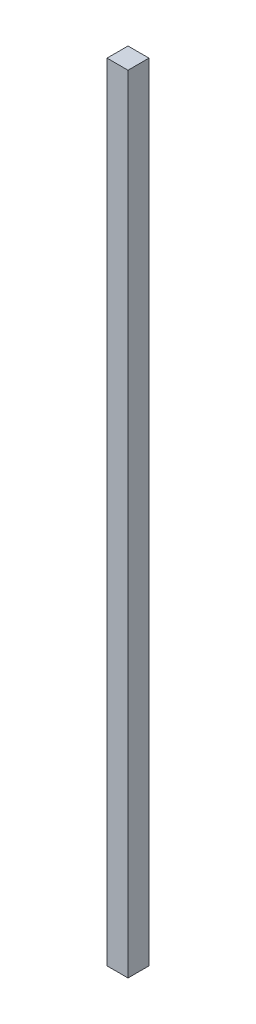
ISO-10303-21;
HEADER;
FILE_DESCRIPTION(('STEP AP214'),'2;1');
FILE_NAME('part.step','',(''),(''),'','','');
FILE_SCHEMA(('AUTOMOTIVE_DESIGN { 1 0 10303 214 1 1 1 1 }'));
ENDSEC;
DATA;
#1=APPLICATION_CONTEXT('core data for automotive mechanical design processes');
#2=APPLICATION_PROTOCOL_DEFINITION('international standard','automotive_design',2000,#1);
#3=PRODUCT_CONTEXT('',#1,'mechanical');
#4=PRODUCT('Part','Part','',(#3));
#5=PRODUCT_RELATED_PRODUCT_CATEGORY('part','',(#4));
#6=PRODUCT_DEFINITION_FORMATION('','',#4);
#7=PRODUCT_DEFINITION_CONTEXT('part definition',#1,'design');
#8=PRODUCT_DEFINITION('design','',#6,#7);
#9=PRODUCT_DEFINITION_SHAPE('','',#8);
#10=(LENGTH_UNIT() NAMED_UNIT(*) SI_UNIT(.MILLI.,.METRE.));
#11=(NAMED_UNIT(*) PLANE_ANGLE_UNIT() SI_UNIT($,.RADIAN.));
#12=(NAMED_UNIT(*) SI_UNIT($,.STERADIAN.) SOLID_ANGLE_UNIT());
#13=UNCERTAINTY_MEASURE_WITH_UNIT(LENGTH_MEASURE(1.E-05),#10,'distance_accuracy_value','');
#14=(GEOMETRIC_REPRESENTATION_CONTEXT(3) GLOBAL_UNCERTAINTY_ASSIGNED_CONTEXT((#13)) GLOBAL_UNIT_ASSIGNED_CONTEXT((#10,
#11,#12)) REPRESENTATION_CONTEXT('',''));
#15=CARTESIAN_POINT('',(0.,0.,0.));
#16=DIRECTION('',(0.,0.,1.));
#17=DIRECTION('',(1.,0.,0.));
#18=AXIS2_PLACEMENT_3D('',#15,#16,#17);
#19=CARTESIAN_POINT('',(2.,150.,-2.));
#20=DIRECTION('',(-1.,0.,0.));
#21=DIRECTION('',(0.,0.,1.));
#22=AXIS2_PLACEMENT_3D('',#19,#20,#21);
#23=PLANE('',#22);
#24=DIRECTION('',(0.,0.,-1.));
#25=VECTOR('',#24,1.);
#26=CARTESIAN_POINT('',(2.,0.,-2.));
#27=LINE('',#26,#25);
#28=CARTESIAN_POINT('',(2.,0.,2.));
#29=VERTEX_POINT('',#28);
#30=CARTESIAN_POINT('',(2.,0.,-2.));
#31=VERTEX_POINT('',#30);
#32=EDGE_CURVE('E113',#29,#31,#27,.T.);
#33=ORIENTED_EDGE('',*,*,#32,.T.);
#34=DIRECTION('',(0.,-1.,0.));
#35=VECTOR('',#34,1.);
#36=CARTESIAN_POINT('',(2.,150.,-2.));
#37=LINE('',#36,#35);
#38=CARTESIAN_POINT('',(2.,150.,-2.));
#39=VERTEX_POINT('',#38);
#40=EDGE_CURVE('E11',#39,#31,#37,.T.);
#41=ORIENTED_EDGE('',*,*,#40,.F.);
#42=DIRECTION('',(0.,0.,-1.));
#43=VECTOR('',#42,1.);
#44=CARTESIAN_POINT('',(2.,150.,-2.));
#45=LINE('',#44,#43);
#46=CARTESIAN_POINT('',(2.,150.,2.));
#47=VERTEX_POINT('',#46);
#48=EDGE_CURVE('E97',#47,#39,#45,.T.);
#49=ORIENTED_EDGE('',*,*,#48,.F.);
#50=DIRECTION('',(0.,-1.,0.));
#51=VECTOR('',#50,1.);
#52=CARTESIAN_POINT('',(2.,150.,2.));
#53=LINE('',#52,#51);
#54=EDGE_CURVE('E109',#47,#29,#53,.T.);
#55=ORIENTED_EDGE('',*,*,#54,.T.);
#56=EDGE_LOOP('',(#33,#41,#49,#55));
#57=FACE_BOUND('',#56,.T.);
#58=ADVANCED_FACE('F45',(#57),#23,.F.);
#59=CARTESIAN_POINT('',(-2.,150.,-2.));
#60=DIRECTION('',(0.,0.,1.));
#61=DIRECTION('',(1.,0.,0.));
#62=AXIS2_PLACEMENT_3D('',#59,#60,#61);
#63=PLANE('',#62);
#64=DIRECTION('',(-1.,0.,0.));
#65=VECTOR('',#64,1.);
#66=CARTESIAN_POINT('',(-2.,0.,-2.));
#67=LINE('',#66,#65);
#68=CARTESIAN_POINT('',(-2.,0.,-2.));
#69=VERTEX_POINT('',#68);
#70=EDGE_CURVE('E102',#31,#69,#67,.T.);
#71=ORIENTED_EDGE('',*,*,#70,.T.);
#72=DIRECTION('',(0.,-1.,0.));
#73=VECTOR('',#72,1.);
#74=CARTESIAN_POINT('',(-2.,150.,-2.));
#75=LINE('',#74,#73);
#76=CARTESIAN_POINT('',(-2.,150.,-2.));
#77=VERTEX_POINT('',#76);
#78=EDGE_CURVE('E54',#77,#69,#75,.T.);
#79=ORIENTED_EDGE('',*,*,#78,.F.);
#80=DIRECTION('',(-1.,0.,0.));
#81=VECTOR('',#80,1.);
#82=CARTESIAN_POINT('',(-2.,150.,-2.));
#83=LINE('',#82,#81);
#84=EDGE_CURVE('E92',#39,#77,#83,.T.);
#85=ORIENTED_EDGE('',*,*,#84,.F.);
#86=ORIENTED_EDGE('',*,*,#40,.T.);
#87=EDGE_LOOP('',(#71,#79,#85,#86));
#88=FACE_BOUND('',#87,.T.);
#89=ADVANCED_FACE('F101',(#88),#63,.F.);
#90=CARTESIAN_POINT('',(-2.,150.,-2.));
#91=DIRECTION('',(1.,0.,0.));
#92=DIRECTION('',(0.,0.,-1.));
#93=AXIS2_PLACEMENT_3D('',#90,#91,#92);
#94=PLANE('',#93);
#95=DIRECTION('',(0.,0.,1.));
#96=VECTOR('',#95,1.);
#97=CARTESIAN_POINT('',(-2.,0.,-2.));
#98=LINE('',#97,#96);
#99=CARTESIAN_POINT('',(-2.,0.,2.));
#100=VERTEX_POINT('',#99);
#101=EDGE_CURVE('E79',#69,#100,#98,.T.);
#102=ORIENTED_EDGE('',*,*,#101,.T.);
#103=DIRECTION('',(0.,-1.,0.));
#104=VECTOR('',#103,1.);
#105=CARTESIAN_POINT('',(-2.,150.,2.));
#106=LINE('',#105,#104);
#107=CARTESIAN_POINT('',(-2.,150.,2.));
#108=VERTEX_POINT('',#107);
#109=EDGE_CURVE('E104',#108,#100,#106,.T.);
#110=ORIENTED_EDGE('',*,*,#109,.F.);
#111=DIRECTION('',(0.,0.,1.));
#112=VECTOR('',#111,1.);
#113=CARTESIAN_POINT('',(-2.,150.,-2.));
#114=LINE('',#113,#112);
#115=EDGE_CURVE('E95',#77,#108,#114,.T.);
#116=ORIENTED_EDGE('',*,*,#115,.F.);
#117=ORIENTED_EDGE('',*,*,#78,.T.);
#118=EDGE_LOOP('',(#102,#110,#116,#117));
#119=FACE_BOUND('',#118,.T.);
#120=ADVANCED_FACE('F105',(#119),#94,.F.);
#121=CARTESIAN_POINT('',(-2.,150.,2.));
#122=DIRECTION('',(0.,0.,-1.));
#123=DIRECTION('',(-1.,0.,0.));
#124=AXIS2_PLACEMENT_3D('',#121,#122,#123);
#125=PLANE('',#124);
#126=DIRECTION('',(1.,0.,0.));
#127=VECTOR('',#126,1.);
#128=CARTESIAN_POINT('',(-2.,0.,2.));
#129=LINE('',#128,#127);
#130=EDGE_CURVE('E85',#100,#29,#129,.T.);
#131=ORIENTED_EDGE('',*,*,#130,.T.);
#132=ORIENTED_EDGE('',*,*,#54,.F.);
#133=DIRECTION('',(1.,0.,0.));
#134=VECTOR('',#133,1.);
#135=CARTESIAN_POINT('',(-2.,150.,2.));
#136=LINE('',#135,#134);
#137=EDGE_CURVE('E62',#108,#47,#136,.T.);
#138=ORIENTED_EDGE('',*,*,#137,.F.);
#139=ORIENTED_EDGE('',*,*,#109,.T.);
#140=EDGE_LOOP('',(#131,#132,#138,#139));
#141=FACE_BOUND('',#140,.T.);
#142=ADVANCED_FACE('F126',(#141),#125,.F.);
#143=CARTESIAN_POINT('',(0.,150.,0.));
#144=DIRECTION('',(0.,1.,0.));
#145=DIRECTION('',(0.,0.,1.));
#146=AXIS2_PLACEMENT_3D('',#143,#144,#145);
#147=PLANE('',#146);
#148=ORIENTED_EDGE('',*,*,#48,.T.);
#149=ORIENTED_EDGE('',*,*,#84,.T.);
#150=ORIENTED_EDGE('',*,*,#115,.T.);
#151=ORIENTED_EDGE('',*,*,#137,.T.);
#152=EDGE_LOOP('',(#148,#149,#150,#151));
#153=FACE_BOUND('',#152,.T.);
#154=ADVANCED_FACE('F93',(#153),#147,.T.);
#155=CARTESIAN_POINT('',(0.,0.,0.));
#156=DIRECTION('',(0.,1.,0.));
#157=DIRECTION('',(0.,0.,1.));
#158=AXIS2_PLACEMENT_3D('',#155,#156,#157);
#159=PLANE('',#158);
#160=ORIENTED_EDGE('',*,*,#32,.F.);
#161=ORIENTED_EDGE('',*,*,#130,.F.);
#162=ORIENTED_EDGE('',*,*,#101,.F.);
#163=ORIENTED_EDGE('',*,*,#70,.F.);
#164=EDGE_LOOP('',(#160,#161,#162,#163));
#165=FACE_BOUND('',#164,.T.);
#166=ADVANCED_FACE('F129',(#165),#159,.F.);
#167=CLOSED_SHELL('',(#58,#89,#120,#142,#154,#166));
#168=MANIFOLD_SOLID_BREP('B2',#167);
#169=ADVANCED_BREP_SHAPE_REPRESENTATION('',(#18,#168),#14);
#170=SHAPE_DEFINITION_REPRESENTATION(#9,#169);
ENDSEC;
END-ISO-10303-21;
